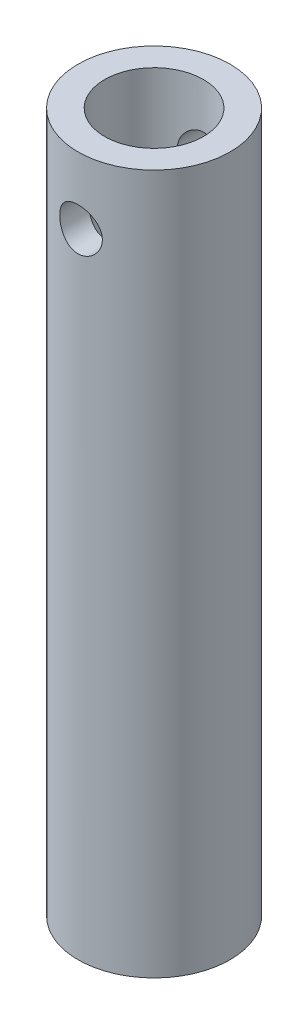
ISO-10303-21;
HEADER;
FILE_DESCRIPTION(('STEP AP214'),'2;1');
FILE_NAME('part.step','',(''),(''),'','','');
FILE_SCHEMA(('AUTOMOTIVE_DESIGN { 1 0 10303 214 1 1 1 1 }'));
ENDSEC;
DATA;
#1=APPLICATION_CONTEXT('core data for automotive mechanical design processes');
#2=APPLICATION_PROTOCOL_DEFINITION('international standard','automotive_design',2000,#1);
#3=PRODUCT_CONTEXT('',#1,'mechanical');
#4=PRODUCT('Part','Part','',(#3));
#5=PRODUCT_RELATED_PRODUCT_CATEGORY('part','',(#4));
#6=PRODUCT_DEFINITION_FORMATION('','',#4);
#7=PRODUCT_DEFINITION_CONTEXT('part definition',#1,'design');
#8=PRODUCT_DEFINITION('design','',#6,#7);
#9=PRODUCT_DEFINITION_SHAPE('','',#8);
#10=(LENGTH_UNIT() NAMED_UNIT(*) SI_UNIT(.MILLI.,.METRE.));
#11=(NAMED_UNIT(*) PLANE_ANGLE_UNIT() SI_UNIT($,.RADIAN.));
#12=(NAMED_UNIT(*) SI_UNIT($,.STERADIAN.) SOLID_ANGLE_UNIT());
#13=UNCERTAINTY_MEASURE_WITH_UNIT(LENGTH_MEASURE(1.E-05),#10,'distance_accuracy_value','');
#14=(GEOMETRIC_REPRESENTATION_CONTEXT(3) GLOBAL_UNCERTAINTY_ASSIGNED_CONTEXT((#13)) GLOBAL_UNIT_ASSIGNED_CONTEXT((#10,
#11,#12)) REPRESENTATION_CONTEXT('',''));
#15=CARTESIAN_POINT('',(0.,0.,0.));
#16=DIRECTION('',(0.,0.,1.));
#17=DIRECTION('',(1.,0.,0.));
#18=AXIS2_PLACEMENT_3D('',#15,#16,#17);
#19=CARTESIAN_POINT('',(0.,0.,0.));
#20=DIRECTION('',(0.,-1.,0.));
#21=DIRECTION('',(0.,0.,-1.));
#22=AXIS2_PLACEMENT_3D('',#19,#20,#21);
#23=CYLINDRICAL_SURFACE('',#22,5.);
#24=CARTESIAN_POINT('',(-1.4,41.6,4.8));
#25=CARTESIAN_POINT('',(-1.39999846094914,41.6769659298858,4.80000116728407));
#26=CARTESIAN_POINT('',(-1.39363150533867,41.7539476164528,4.80187142176869));
#27=CARTESIAN_POINT('',(-1.36838679401883,41.9056771416332,4.80912513994316));
#28=CARTESIAN_POINT('',(-1.34950358963581,41.9804239925426,4.81451013368184));
#29=CARTESIAN_POINT('',(-1.29990434687922,42.1254665067442,4.82813668155635));
#30=CARTESIAN_POINT('',(-1.26920611122644,42.1957686825419,4.83637393608176));
#31=CARTESIAN_POINT('',(-1.19690512813336,42.3302386159557,4.85477126739663));
#32=CARTESIAN_POINT('',(-1.15530122087737,42.3944057201172,4.86493154866758));
#33=CARTESIAN_POINT('',(-1.06114275468311,42.5165529838908,4.88634412299458));
#34=CARTESIAN_POINT('',(-1.00834099737541,42.5743389639482,4.89761732891019));
#35=CARTESIAN_POINT('',(-0.893816601905838,42.6803621013389,4.91980577835347));
#36=CARTESIAN_POINT('',(-0.832092958306449,42.7285981810079,4.93072098136626));
#37=CARTESIAN_POINT('',(-0.700116909454538,42.8149748989167,4.9511985717483));
#38=CARTESIAN_POINT('',(-0.629732260141498,42.8529205764065,4.96073342375542));
#39=CARTESIAN_POINT('',(-0.483269831180904,42.9163646054877,4.97713487630929));
#40=CARTESIAN_POINT('',(-0.407193117198153,42.9418652803328,4.98400197482787));
#41=CARTESIAN_POINT('',(-0.253534824248687,42.9790615168387,4.99414627569901));
#42=CARTESIAN_POINT('',(-0.176039082241839,42.9910878404104,4.99750934082078));
#43=CARTESIAN_POINT('',(-0.0200618306725404,43.0020366524892,5.0005676959715));
#44=CARTESIAN_POINT('',(0.0584194950033849,43.0009615501656,5.00026366032921));
#45=CARTESIAN_POINT('',(0.211830874345753,42.9859667444535,4.99608412754308));
#46=CARTESIAN_POINT('',(0.28679901525802,42.9724047068888,4.99230808388081));
#47=CARTESIAN_POINT('',(0.433349451843502,42.933401307128,4.98172751793994));
#48=CARTESIAN_POINT('',(0.50493154490278,42.9079592350436,4.97492281468571));
#49=CARTESIAN_POINT('',(0.64356653417568,42.8456564042964,4.95890589379392));
#50=CARTESIAN_POINT('',(0.71056313745783,42.8086770337964,4.94966883112298));
#51=CARTESIAN_POINT('',(0.837519083052786,42.7244413600416,4.92977657041354));
#52=CARTESIAN_POINT('',(0.897476930293568,42.6771828795045,4.91912107211315));
#53=CARTESIAN_POINT('',(1.01078870393436,42.5718483042977,4.8971168137207));
#54=CARTESIAN_POINT('',(1.06385145006009,42.513460943931,4.88575679332709));
#55=CARTESIAN_POINT('',(1.15950771223469,42.3885008756987,4.86394443478091));
#56=CARTESIAN_POINT('',(1.20210044712442,42.3219275576408,4.85349216439244));
#57=CARTESIAN_POINT('',(1.27586020154395,42.1818022200025,4.83463000670278));
#58=CARTESIAN_POINT('',(1.30694032351486,42.1082021961851,4.82623580811576));
#59=CARTESIAN_POINT('',(1.35618652914374,41.9565262981445,4.81263110576324));
#60=CARTESIAN_POINT('',(1.37435619769613,41.8784516729131,4.80741971827105));
#61=CARTESIAN_POINT('',(1.39674755802298,41.7227848973634,4.80096120977581));
#62=CARTESIAN_POINT('',(1.40140682196845,41.6452607817949,4.79958977360412));
#63=CARTESIAN_POINT('',(1.39785708173985,41.4905395473235,4.80062489240105));
#64=CARTESIAN_POINT('',(1.38964960911732,41.4133423905989,4.80303099772196));
#65=CARTESIAN_POINT('',(1.36098674315498,41.2632052586876,4.81122924489054));
#66=CARTESIAN_POINT('',(1.34080153845445,41.1902092150406,4.81694662610026));
#67=CARTESIAN_POINT('',(1.2890636214304,41.048640827144,4.83104846338543));
#68=CARTESIAN_POINT('',(1.25750931530452,40.9800691047175,4.83943329338373));
#69=CARTESIAN_POINT('',(1.18306339424192,40.8474848682545,4.85817493791623));
#70=CARTESIAN_POINT('',(1.13991875668025,40.7836205559952,4.868574106982));
#71=CARTESIAN_POINT('',(1.04382535551189,40.6638779023745,4.89007649908404));
#72=CARTESIAN_POINT('',(0.990874553387364,40.60800122578,4.90117986819416));
#73=CARTESIAN_POINT('',(0.874634922111244,40.5039661089508,4.92327316937945));
#74=CARTESIAN_POINT('',(0.811067688377642,40.4561148203352,4.93424788588004));
#75=CARTESIAN_POINT('',(0.676552150082872,40.3717580295338,4.95448242786587));
#76=CARTESIAN_POINT('',(0.605604235750171,40.3352519279162,4.96374234394348));
#77=CARTESIAN_POINT('',(0.458837080620815,40.2749671765905,4.97944452424279));
#78=CARTESIAN_POINT('',(0.383059761979972,40.2510922690681,4.98590802791053));
#79=CARTESIAN_POINT('',(0.22835840988794,40.2164788076392,4.99538286173743));
#80=CARTESIAN_POINT('',(0.149435156159181,40.2057370193275,4.99839504187191));
#81=CARTESIAN_POINT('',(-0.00646074749381435,40.19791440352,5.00058316769304));
#82=CARTESIAN_POINT('',(-0.083409429980672,40.2003851306364,4.99988504950269));
#83=CARTESIAN_POINT('',(-0.235751254024445,40.2178642590766,4.99502047571148));
#84=CARTESIAN_POINT('',(-0.311144464836564,40.2328721009631,4.99085417486961));
#85=CARTESIAN_POINT('',(-0.457637512916759,40.2747359069444,4.97955075921071));
#86=CARTESIAN_POINT('',(-0.528767741189635,40.301492697122,4.97243853906127));
#87=CARTESIAN_POINT('',(-0.665569134027809,40.3660066752,4.95598326056242));
#88=CARTESIAN_POINT('',(-0.731239474238709,40.4037655203693,4.94663986616359));
#89=CARTESIAN_POINT('',(-0.857310738423172,40.4904779988191,4.92637951709497));
#90=CARTESIAN_POINT('',(-0.917505254191581,40.5397229020334,4.91542497315988));
#91=CARTESIAN_POINT('',(-1.02892738400894,40.6474681189736,4.8933160260062));
#92=CARTESIAN_POINT('',(-1.08015255133947,40.7059709498786,4.88216156916595));
#93=CARTESIAN_POINT('',(-1.1734540054092,40.8323247481879,4.86059261767263));
#94=CARTESIAN_POINT('',(-1.21527034952428,40.9003724182135,4.85020350552202));
#95=CARTESIAN_POINT('',(-1.28681304035863,41.0428146608271,4.83171669264465));
#96=CARTESIAN_POINT('',(-1.31654651115799,41.1172054620991,4.82361764255334));
#97=CARTESIAN_POINT('',(-1.35964867256214,41.2593218997661,4.8116297141418));
#98=CARTESIAN_POINT('',(-1.37474260875013,41.3264921592486,4.80730606134675));
#99=CARTESIAN_POINT('',(-1.39491824305981,41.4624375713905,4.80149088551332));
#100=CARTESIAN_POINT('',(-1.40000137551085,41.5312124927079,4.79999895675188));
#101=CARTESIAN_POINT('',(-1.4,41.6,4.8));
#102=B_SPLINE_CURVE_WITH_KNOTS('',3,(#24,#25,#26,#27,#28,#29,#30,#31,#32,#33,#34,#35,#36,#37,
#38,#39,#40,#41,#42,#43,#44,#45,#46,#47,#48,#49,#50,#51,#52,#53,#54,#55,#56,#57,#58,#59,#60,#61,
#62,#63,#64,#65,#66,#67,#68,#69,#70,#71,#72,#73,#74,#75,#76,#77,#78,#79,#80,#81,#82,#83,#84,#85,
#86,#87,#88,#89,#90,#91,#92,#93,#94,#95,#96,#97,#98,#99,#100,#101),.UNSPECIFIED.,.T.,.F.,(4,2,2,
2,2,2,2,2,2,2,2,2,2,2,2,2,2,2,2,2,2,2,2,2,2,2,2,2,2,2,2,2,2,2,2,2,2,2,4),(0.,0.230644547119654,
0.461389566273118,0.691788254753479,0.92221145602993,1.15838055253431,1.39457628451212,
1.63497587607745,1.87533057226205,2.10964623883447,2.34391881867674,2.57168306807728,
2.79946092921251,3.02966229022292,3.25991245918694,3.49793361913972,3.73597253227433,
3.97577322729964,4.21550730991033,4.44738513963405,4.67923537060482,4.90604444612907,
5.13288532975909,5.365149674089,5.59746235613257,5.83726965112066,6.07706427354867,
6.3150041803502,6.55288547585395,6.78274520049664,7.01259466877346,7.2405401749279,
7.4685200348864,7.70307023270649,7.93768431334414,8.1781478109311,8.4184693244571,
8.62463505461541,8.83077124358129),.UNSPECIFIED.);
#103=CARTESIAN_POINT('',(-1.4,41.6,4.8));
#104=VERTEX_POINT('',#103);
#105=EDGE_CURVE('E73',#104,#104,#102,.T.);
#106=ORIENTED_EDGE('',*,*,#105,.T.);
#107=EDGE_LOOP('',(#106));
#108=FACE_BOUND('',#107,.T.);
#109=CARTESIAN_POINT('',(0.,46.,0.));
#110=DIRECTION('',(0.,-1.,0.));
#111=DIRECTION('',(0.,0.,-1.));
#112=AXIS2_PLACEMENT_3D('',#109,#110,#111);
#113=CIRCLE('',#112,5.);
#114=CARTESIAN_POINT('',(0.,46.,-5.));
#115=VERTEX_POINT('',#114);
#116=EDGE_CURVE('E10',#115,#115,#113,.T.);
#117=ORIENTED_EDGE('',*,*,#116,.T.);
#118=EDGE_LOOP('',(#117));
#119=FACE_BOUND('',#118,.T.);
#120=CARTESIAN_POINT('',(0.,0.,0.));
#121=DIRECTION('',(0.,-1.,0.));
#122=DIRECTION('',(0.,0.,-1.));
#123=AXIS2_PLACEMENT_3D('',#120,#121,#122);
#124=CIRCLE('',#123,5.);
#125=CARTESIAN_POINT('',(0.,0.,-5.));
#126=VERTEX_POINT('',#125);
#127=EDGE_CURVE('E84',#126,#126,#124,.T.);
#128=ORIENTED_EDGE('',*,*,#127,.F.);
#129=EDGE_LOOP('',(#128));
#130=FACE_BOUND('',#129,.T.);
#131=CARTESIAN_POINT('',(0.,43.,-5.));
#132=CARTESIAN_POINT('',(-0.0770327145729713,42.9999984893789,-4.99999900029696));
#133=CARTESIAN_POINT('',(-0.154081136740043,42.9936208655901,-4.99820245905414));
#134=CARTESIAN_POINT('',(-0.305948997089834,42.9683299449294,-4.9912105509116));
#135=CARTESIAN_POINT('',(-0.380767508720277,42.9494115110506,-4.98601379121481));
#136=CARTESIAN_POINT('',(-0.525962158797004,42.8997093467444,-4.97279343200931));
#137=CARTESIAN_POINT('',(-0.596344197953587,42.8689417809911,-4.96477368491707));
#138=CARTESIAN_POINT('',(-0.730949843609341,42.7964771545498,-4.946749433594));
#139=CARTESIAN_POINT('',(-0.795172875253764,42.7547790750089,-4.9367447443643));
#140=CARTESIAN_POINT('',(-0.917265077595306,42.6605220942066,-4.9155422190053));
#141=CARTESIAN_POINT('',(-0.974955969889462,42.6077372187264,-4.90432237800567));
#142=CARTESIAN_POINT('',(-1.08079329983553,42.4932874892586,-4.88209141574842));
#143=CARTESIAN_POINT('',(-1.1289383706349,42.4316213657572,-4.87108032458524));
#144=CARTESIAN_POINT('',(-1.21521302945673,42.2997036745525,-4.85028558598148));
#145=CARTESIAN_POINT('',(-1.25313270793239,42.2293100701614,-4.84052954568348));
#146=CARTESIAN_POINT('',(-1.31652628832609,42.0828287001048,-4.82367516293908));
#147=CARTESIAN_POINT('',(-1.3420027490408,42.0067421088471,-4.81657627415195));
#148=CARTESIAN_POINT('',(-1.37915835249243,41.8530201143085,-4.8060679730339));
#149=CARTESIAN_POINT('',(-1.39116289049922,41.775469447508,-4.80257172313195));
#150=CARTESIAN_POINT('',(-1.40204903325793,41.6193821629011,-4.79940552886254));
#151=CARTESIAN_POINT('',(-1.4009333652408,41.5408457533865,-4.7997347893054));
#152=CARTESIAN_POINT('',(-1.38586802479697,41.3875962925328,-4.80410498318563));
#153=CARTESIAN_POINT('',(-1.37231734248415,41.3128401957548,-4.80803051988166));
#154=CARTESIAN_POINT('',(-1.33340782537443,41.1667076432519,-4.81896544605214));
#155=CARTESIAN_POINT('',(-1.30804796098482,41.0953314828073,-4.82597510441519));
#156=CARTESIAN_POINT('',(-1.24592710596136,40.9569698467708,-4.84238625481907));
#157=CARTESIAN_POINT('',(-1.20903033319477,40.8900488246171,-4.85181597926293));
#158=CARTESIAN_POINT('',(-1.12497759066623,40.7632104044494,-4.87199022050669));
#159=CARTESIAN_POINT('',(-1.07781941706806,40.7032945151807,-4.88273501952731));
#160=CARTESIAN_POINT('',(-0.972565035243,40.5898937384194,-4.90480434363037));
#161=CARTESIAN_POINT('',(-0.914135248901377,40.5367193388453,-4.91613578960986));
#162=CARTESIAN_POINT('',(-0.789047798345443,40.4408568699801,-4.93775519353465));
#163=CARTESIAN_POINT('',(-0.722389740864611,40.3981693021943,-4.94804310156168));
#164=CARTESIAN_POINT('',(-0.582224966888401,40.3243358720784,-4.96649070133551));
#165=CARTESIAN_POINT('',(-0.508684489113187,40.2932510848785,-4.97463906607746));
#166=CARTESIAN_POINT('',(-0.357140122479902,40.2439782258357,-4.98780780944171));
#167=CARTESIAN_POINT('',(-0.279137317449736,40.225787036596,-4.99282894412588));
#168=CARTESIAN_POINT('',(-0.123528267665704,40.2033165846085,-4.99906109804467));
#169=CARTESIAN_POINT('',(-0.0459874326581305,40.1986157276385,-5.00038754197865));
#170=CARTESIAN_POINT('',(0.108776426212275,40.2020883711372,-4.99941533321488));
#171=CARTESIAN_POINT('',(0.185999485551479,40.2102603931094,-4.99711709682467));
#172=CARTESIAN_POINT('',(0.336397512488273,40.2389027349917,-4.98922874555777));
#173=CARTESIAN_POINT('',(0.409621765649552,40.2591335682751,-4.98370277490728));
#174=CARTESIAN_POINT('',(0.551626719729456,40.3110372833218,-4.96999007504664));
#175=CARTESIAN_POINT('',(0.620406914809998,40.3427114649115,-4.96180304358267));
#176=CARTESIAN_POINT('',(0.753176057754266,40.4173556766488,-4.94341133793915));
#177=CARTESIAN_POINT('',(0.817033767023282,40.4605493278687,-4.93316784050029));
#178=CARTESIAN_POINT('',(0.936741056940276,40.5567290068908,-4.91184479891555));
#179=CARTESIAN_POINT('',(0.99258888421398,40.6097171729332,-4.90076507252566));
#180=CARTESIAN_POINT('',(1.09649938873068,40.7259556372674,-4.87858629569558));
#181=CARTESIAN_POINT('',(1.14426345510986,40.7894753650262,-4.86749750838805));
#182=CARTESIAN_POINT('',(1.22846653416967,40.9238665041086,-4.84693260355014));
#183=CARTESIAN_POINT('',(1.26490597001672,40.9947376406008,-4.83745642576752));
#184=CARTESIAN_POINT('',(1.32515568180928,41.1415044657878,-4.82130025397621));
#185=CARTESIAN_POINT('',(1.34903525219373,41.2173699306397,-4.81460496149088));
#186=CARTESIAN_POINT('',(1.38362846644349,41.3722621449352,-4.80477906400824));
#187=CARTESIAN_POINT('',(1.39434590395942,41.4512879766994,-4.80164743189541));
#188=CARTESIAN_POINT('',(1.40207643676785,41.6071837578906,-4.79939533652457));
#189=CARTESIAN_POINT('',(1.3995719756054,41.6840280837597,-4.80013365834011));
#190=CARTESIAN_POINT('',(1.38206149373553,41.8361519316651,-4.8052041945668));
#191=CARTESIAN_POINT('',(1.36705585975352,41.9114315020335,-4.80953629780384));
#192=CARTESIAN_POINT('',(1.32526152105332,42.057611795769,-4.82121794437136));
#193=CARTESIAN_POINT('',(1.29858491712657,42.128547032041,-4.82853873737711));
#194=CARTESIAN_POINT('',(1.23429257584711,42.2649904019804,-4.84537110346427));
#195=CARTESIAN_POINT('',(1.19667496748523,42.3304976049419,-4.85488305119474));
#196=CARTESIAN_POINT('',(1.11014809012595,42.4565037278744,-4.87540826050106));
#197=CARTESIAN_POINT('',(1.06091437202679,42.5167736051544,-4.88645998809172));
#198=CARTESIAN_POINT('',(0.953157030759441,42.628352710852,-4.9086161413664));
#199=CARTESIAN_POINT('',(0.894631097907475,42.6796597047679,-4.91972057948473));
#200=CARTESIAN_POINT('',(0.768234423803878,42.773090119644,-4.94105425579585));
#201=CARTESIAN_POINT('',(0.700171058796768,42.8149598968524,-4.9512556469523));
#202=CARTESIAN_POINT('',(0.557686261861201,42.8865986111093,-4.96931868025536));
#203=CARTESIAN_POINT('',(0.483268522983519,42.9163745197469,-4.97718166968672));
#204=CARTESIAN_POINT('',(0.341052181714766,42.9595593271196,-4.98879098264941));
#205=CARTESIAN_POINT('',(0.273805516328351,42.9746871703952,-4.99296218750469));
#206=CARTESIAN_POINT('',(0.137709953322042,42.9949075686508,-4.99856697568072));
#207=CARTESIAN_POINT('',(0.0688612526056983,43.0000013503777,-5.00000089365673));
#208=CARTESIAN_POINT('',(0.,43.,-5.));
#209=B_SPLINE_CURVE_WITH_KNOTS('',3,(#131,#132,#133,#134,#135,#136,#137,#138,#139,#140,#141,
#142,#143,#144,#145,#146,#147,#148,#149,#150,#151,#152,#153,#154,#155,#156,#157,#158,#159,#160,
#161,#162,#163,#164,#165,#166,#167,#168,#169,#170,#171,#172,#173,#174,#175,#176,#177,#178,#179,
#180,#181,#182,#183,#184,#185,#186,#187,#188,#189,#190,#191,#192,#193,#194,#195,#196,#197,#198,
#199,#200,#201,#202,#203,#204,#205,#206,#207,#208),.UNSPECIFIED.,.T.,.F.,(4,2,2,2,2,2,2,2,2,2,2,
2,2,2,2,2,2,2,2,2,2,2,2,2,2,2,2,2,2,2,2,2,2,2,2,2,2,2,4),(0.,0.230845454724487,0.46178552758447,
0.692411659940941,0.923059297021747,1.15896631327548,1.39490708436163,1.63537521509923,
1.8757938756438,2.11027142552802,2.34470023661011,2.5718605950441,2.79904076233936,
3.02900228295248,3.25901324112637,3.49733284938025,3.7356638524261,3.9752322675011,
4.21474274026858,4.4466820107644,4.67859464414303,4.9060481785949,5.13352755715304,
5.36579259943571,5.59810840751108,5.83770027387453,6.07728318635397,6.31553004318533,
6.55370821528107,6.7832571355847,7.0127989550261,7.24018281446682,7.4676055814576,
7.70234779932216,7.93714845659686,8.17765852294213,8.41802974824775,8.62441285537236,
8.83077072889118),.UNSPECIFIED.);
#210=CARTESIAN_POINT('',(0.,43.,-5.));
#211=VERTEX_POINT('',#210);
#212=EDGE_CURVE('E78',#211,#211,#209,.T.);
#213=ORIENTED_EDGE('',*,*,#212,.T.);
#214=EDGE_LOOP('',(#213));
#215=FACE_BOUND('',#214,.T.);
#216=ADVANCED_FACE('F31',(#108,#119,#130,#215),#23,.T.);
#217=CARTESIAN_POINT('',(0.,0.,0.));
#218=DIRECTION('',(0.,-1.,0.));
#219=DIRECTION('',(0.,0.,-1.));
#220=AXIS2_PLACEMENT_3D('',#217,#218,#219);
#221=CYLINDRICAL_SURFACE('',#220,3.25);
#222=CARTESIAN_POINT('',(-1.4,41.6,2.93300187521249));
#223=CARTESIAN_POINT('',(-1.39999093014388,41.5255905970456,2.93301088558229));
#224=CARTESIAN_POINT('',(-1.39403018986805,41.4510708180436,2.93587503097016));
#225=CARTESIAN_POINT('',(-1.3704252902362,41.3041977692494,2.94696321535698));
#226=CARTESIAN_POINT('',(-1.35275043272235,41.2318507154563,2.95520133656749));
#227=CARTESIAN_POINT('',(-1.3065487791051,41.0917202716736,2.97591388371925));
#228=CARTESIAN_POINT('',(-1.27806829176898,41.0239188399893,2.98837020792608));
#229=CARTESIAN_POINT('',(-1.21120040858192,40.8940743988769,3.01608991332933));
#230=CARTESIAN_POINT('',(-1.17281488275051,40.8320303054963,3.03135276451197));
#231=CARTESIAN_POINT('',(-1.08449405632017,40.7112936630653,3.06410156382041));
#232=CARTESIAN_POINT('',(-1.03400092879853,40.6530302975894,3.08166611976692));
#233=CARTESIAN_POINT('',(-0.924067826834253,40.5454785707361,3.11639541161537));
#234=CARTESIAN_POINT('',(-0.864624279049276,40.4961938113996,3.1335599846543));
#235=CARTESIAN_POINT('',(-0.735055194539326,40.4057552106996,3.16652210213821));
#236=CARTESIAN_POINT('',(-0.664559307049742,40.3650914117391,3.18221770868869));
#237=CARTESIAN_POINT('',(-0.516928211286968,40.2963879064639,3.20950250241949));
#238=CARTESIAN_POINT('',(-0.439796163542614,40.2683422298719,3.22109363108363));
#239=CARTESIAN_POINT('',(-0.285595215575721,40.2272488049191,3.2383046938537));
#240=CARTESIAN_POINT('',(-0.208757576112905,40.2134590187252,3.24421876493758));
#241=CARTESIAN_POINT('',(-0.0536469318825666,40.1988638336,3.25048245087373));
#242=CARTESIAN_POINT('',(0.0246254331475464,40.1980527820414,3.25083448815731));
#243=CARTESIAN_POINT('',(0.174960221219282,40.2090651195684,3.2461024585992));
#244=CARTESIAN_POINT('',(0.24709572392598,40.2200711209289,3.24137006865471));
#245=CARTESIAN_POINT('',(0.388379116409237,40.2529943863577,3.22749163400091));
#246=CARTESIAN_POINT('',(0.45752678491065,40.2749124570597,3.21834526300618));
#247=CARTESIAN_POINT('',(0.592150833757654,40.3292874367396,3.19633930528483));
#248=CARTESIAN_POINT('',(0.657554839870065,40.3619004876966,3.18342503749674));
#249=CARTESIAN_POINT('',(0.782133965204853,40.4365799625469,3.15513127677334));
#250=CARTESIAN_POINT('',(0.841306829735497,40.4786497911614,3.13975089653737));
#251=CARTESIAN_POINT('',(0.956437940690583,40.5746917071716,3.10669868686324));
#252=CARTESIAN_POINT('',(1.01182705582631,40.6293175844333,3.08894150959544));
#253=CARTESIAN_POINT('',(1.1129149231789,40.7470948730163,3.05397893030838));
#254=CARTESIAN_POINT('',(1.1586094070454,40.8102500196587,3.03677377415075));
#255=CARTESIAN_POINT('',(1.24061711426155,40.9462403024718,3.0042290452743));
#256=CARTESIAN_POINT('',(1.27651866663988,41.0193479247766,2.98898254712737));
#257=CARTESIAN_POINT('',(1.33526472779319,41.1714011062078,2.96320927599794));
#258=CARTESIAN_POINT('',(1.35811931722897,41.2503421047973,2.95267886052069));
#259=CARTESIAN_POINT('',(1.38862096792775,41.4061057504887,2.93845165995406));
#260=CARTESIAN_POINT('',(1.3971956461687,41.482708002584,2.93433924462269));
#261=CARTESIAN_POINT('',(1.40163420516463,41.6363508611614,2.93222290543734));
#262=CARTESIAN_POINT('',(1.39750301329099,41.7133912861526,2.9342166136106));
#263=CARTESIAN_POINT('',(1.37749503020388,41.859990516208,2.94365612836274));
#264=CARTESIAN_POINT('',(1.36246677192184,41.9296938830961,2.95070768294784));
#265=CARTESIAN_POINT('',(1.32223652637767,42.0655219375664,2.96895178392543));
#266=CARTESIAN_POINT('',(1.29703204964224,42.1316457449658,2.98014534354706));
#267=CARTESIAN_POINT('',(1.23595100406396,42.2616716653178,3.00600520763991));
#268=CARTESIAN_POINT('',(1.19965643978086,42.3253506430283,3.02080182348023));
#269=CARTESIAN_POINT('',(1.11783183256591,42.446033495775,3.05202685068084));
#270=CARTESIAN_POINT('',(1.07229760710689,42.5030343293106,3.06845599931661));
#271=CARTESIAN_POINT('',(0.968561641281718,42.6139774627374,3.1028415857099));
#272=CARTESIAN_POINT('',(0.909597088896468,42.6672072584592,3.12080499530673));
#273=CARTESIAN_POINT('',(0.783170573892042,42.7631598951,3.1549051349678));
#274=CARTESIAN_POINT('',(0.715707716050678,42.8058816276844,3.17104167224647));
#275=CARTESIAN_POINT('',(0.57348548498212,42.8796728433301,3.19982804591806));
#276=CARTESIAN_POINT('',(0.498688800394717,42.9106783845501,3.21245865190694));
#277=CARTESIAN_POINT('',(0.344252899379343,42.9594244793062,3.23265184464062));
#278=CARTESIAN_POINT('',(0.264616821082985,42.9771735318939,3.24021767820882));
#279=CARTESIAN_POINT('',(0.109107654383199,42.99777973654,3.24903225646612));
#280=CARTESIAN_POINT('',(0.0333906948525169,43.0016394020166,3.25070606338754));
#281=CARTESIAN_POINT('',(-0.117595557598838,42.9970941584147,3.24874849393872));
#282=CARTESIAN_POINT('',(-0.192864935961764,42.9886916708972,3.2451181650424));
#283=CARTESIAN_POINT('',(-0.337715720470401,42.9605796428864,3.23319119551847));
#284=CARTESIAN_POINT('',(-0.407404267081021,42.9413338680271,3.22508620469521));
#285=CARTESIAN_POINT('',(-0.542524026869703,42.8926054322312,3.20512656303101));
#286=CARTESIAN_POINT('',(-0.60795445876168,42.8631208989228,3.19327122639595));
#287=CARTESIAN_POINT('',(-0.73600135790037,42.7932572256845,3.16627211597094));
#288=CARTESIAN_POINT('',(-0.798352754840212,42.7524419470218,3.15100286516438));
#289=CARTESIAN_POINT('',(-0.915592652000102,42.6616924540471,3.11895655638203));
#290=CARTESIAN_POINT('',(-0.970478152987609,42.6117545937355,3.10217889691075));
#291=CARTESIAN_POINT('',(-1.07543268717154,42.4998620638735,3.06744542946636));
#292=CARTESIAN_POINT('',(-1.12485145272542,42.4372940256545,3.04949363990536));
#293=CARTESIAN_POINT('',(-1.21260620470089,42.3042285002219,3.01567673982518));
#294=CARTESIAN_POINT('',(-1.25093568508671,42.2337263916751,2.99981285723473));
#295=CARTESIAN_POINT('',(-1.31516965699396,42.0865875719933,2.97221388096729));
#296=CARTESIAN_POINT('',(-1.34108757795602,42.0099575965621,2.96047432840259));
#297=CARTESIAN_POINT('',(-1.37932345934367,41.8528878129908,2.94286063205464));
#298=CARTESIAN_POINT('',(-1.39168704006723,41.7724617409444,2.93696681949138));
#299=CARTESIAN_POINT('',(-1.39900299882393,41.661118247277,2.93347632828598));
#300=CARTESIAN_POINT('',(-1.40000372602548,41.6305684376268,2.93299817362484));
#301=CARTESIAN_POINT('',(-1.4,41.6,2.93300187521249));
#302=B_SPLINE_CURVE_WITH_KNOTS('',3,(#222,#223,#224,#225,#226,#227,#228,#229,#230,#231,#232,
#233,#234,#235,#236,#237,#238,#239,#240,#241,#242,#243,#244,#245,#246,#247,#248,#249,#250,#251,
#252,#253,#254,#255,#256,#257,#258,#259,#260,#261,#262,#263,#264,#265,#266,#267,#268,#269,#270,
#271,#272,#273,#274,#275,#276,#277,#278,#279,#280,#281,#282,#283,#284,#285,#286,#287,#288,#289,
#290,#291,#292,#293,#294,#295,#296,#297,#298,#299,#300,#301),.UNSPECIFIED.,.T.,.F.,(4,2,2,2,2,2,
2,2,2,2,2,2,2,2,2,2,2,2,2,2,2,2,2,2,2,2,2,2,2,2,2,2,2,2,2,2,2,2,2,4),(0.,0.223135920094107,
0.446858917370905,0.669633760322705,0.892366575280347,1.12856073674564,1.36484944701353,
1.61222556459683,1.85948451251169,2.09310289947503,2.32661953586922,2.54496549760324,
2.76332760213894,2.98503127873555,3.20681490346133,3.44514385028805,3.68357751177696,
3.93087072226507,4.17797260357014,4.40828820588281,4.63851450243489,4.85251105668223,
5.06655999402435,5.28995674794358,5.51345485360825,5.75665387173143,5.99987853020229,
6.24441206232659,6.48878868326307,6.71512711726157,6.94142085942494,7.15869989026888,
7.3760186760864,7.6032645143291,7.83060137485128,8.0746431196419,8.31882775366335,
8.56274757694694,8.80584388643553,8.89751128578112),.UNSPECIFIED.);
#303=CARTESIAN_POINT('',(-1.4,41.6,2.93300187521249));
#304=VERTEX_POINT('',#303);
#305=EDGE_CURVE('E52',#304,#304,#302,.T.);
#306=ORIENTED_EDGE('',*,*,#305,.T.);
#307=EDGE_LOOP('',(#306));
#308=FACE_BOUND('',#307,.T.);
#309=CARTESIAN_POINT('',(0.,12.,0.));
#310=DIRECTION('',(0.,-1.,0.));
#311=DIRECTION('',(0.,0.,-1.));
#312=AXIS2_PLACEMENT_3D('',#309,#310,#311);
#313=CIRCLE('',#312,3.25);
#314=CARTESIAN_POINT('',(0.,12.,-3.25));
#315=VERTEX_POINT('',#314);
#316=EDGE_CURVE('E49',#315,#315,#313,.T.);
#317=ORIENTED_EDGE('',*,*,#316,.T.);
#318=EDGE_LOOP('',(#317));
#319=FACE_BOUND('',#318,.T.);
#320=CARTESIAN_POINT('',(0.,46.,0.));
#321=DIRECTION('',(0.,-1.,0.));
#322=DIRECTION('',(0.,0.,-1.));
#323=AXIS2_PLACEMENT_3D('',#320,#321,#322);
#324=CIRCLE('',#323,3.25);
#325=CARTESIAN_POINT('',(0.,46.,-3.25));
#326=VERTEX_POINT('',#325);
#327=EDGE_CURVE('E44',#326,#326,#324,.T.);
#328=ORIENTED_EDGE('',*,*,#327,.F.);
#329=EDGE_LOOP('',(#328));
#330=FACE_BOUND('',#329,.T.);
#331=CARTESIAN_POINT('',(0.,43.,-3.25));
#332=CARTESIAN_POINT('',(0.0747743147945643,42.9999913237963,-3.24999339428539));
#333=CARTESIAN_POINT('',(0.149654577301456,42.993974299065,-3.24738996837437));
#334=CARTESIAN_POINT('',(0.297282867223013,42.9701253800155,-3.23722621698088));
#335=CARTESIAN_POINT('',(0.370025066681506,42.9522638481127,-3.22965345762084));
#336=CARTESIAN_POINT('',(0.510995871705431,42.9055175931012,-3.21036223920508));
#337=CARTESIAN_POINT('',(0.579239228130689,42.8766712370335,-3.19865821981252));
#338=CARTESIAN_POINT('',(0.709848075632318,42.8089381290452,-3.17223292035702));
#339=CARTESIAN_POINT('',(0.772215118290818,42.7700540376865,-3.15751244003804));
#340=CARTESIAN_POINT('',(0.892703755275299,42.6811806516239,-3.12564392498068));
#341=CARTESIAN_POINT('',(0.950474056512367,42.6307451570414,-3.10841290803657));
#342=CARTESIAN_POINT('',(1.05704218417876,42.5211458614407,-3.07380987589992));
#343=CARTESIAN_POINT('',(1.10583497992168,42.4619771999181,-3.05643778731385));
#344=CARTESIAN_POINT('',(1.19564555354856,42.332765341118,-3.02247609346468));
#345=CARTESIAN_POINT('',(1.23610869824349,42.2623100573412,-3.00597787367286));
#346=CARTESIAN_POINT('',(1.30445280731839,42.1147826518719,-2.97696013585359));
#347=CARTESIAN_POINT('',(1.33234069019882,42.0377141963814,-2.96443843120093));
#348=CARTESIAN_POINT('',(1.37326686956236,41.8831915498328,-2.94569595516167));
#349=CARTESIAN_POINT('',(1.38698361216309,41.8059531535741,-2.93918906113811));
#350=CARTESIAN_POINT('',(1.40129160183223,41.6500182141194,-2.93239686795149));
#351=CARTESIAN_POINT('',(1.40189082517852,41.571322586153,-2.93210778796775));
#352=CARTESIAN_POINT('',(1.39045519587113,41.4216881225234,-2.93754345515719));
#353=CARTESIAN_POINT('',(1.37946495694422,41.3506476553248,-2.94277099214311));
#354=CARTESIAN_POINT('',(1.34692369366352,41.2115397337023,-2.95780566938122));
#355=CARTESIAN_POINT('',(1.32537047772325,41.1434728994354,-2.96761375997811));
#356=CARTESIAN_POINT('',(1.27188980323503,41.0104670738309,-2.99092961754472));
#357=CARTESIAN_POINT('',(1.23974528528026,40.9456293578002,-3.00451377293995));
#358=CARTESIAN_POINT('',(1.16614913925896,40.8220047595963,-3.03383633415045));
#359=CARTESIAN_POINT('',(1.12469370720232,40.7632203648751,-3.04957561941895));
#360=CARTESIAN_POINT('',(1.02923241728228,40.6477451501721,-3.08317423229472));
#361=CARTESIAN_POINT('',(0.974428159075206,40.5917306281335,-3.1010962054922));
#362=CARTESIAN_POINT('',(0.856039165512505,40.4894514527876,-3.13584129403117));
#363=CARTESIAN_POINT('',(0.792452090963521,40.4431894052502,-3.15266411486301));
#364=CARTESIAN_POINT('',(0.656126410366088,40.3606419164053,-3.1838667347346));
#365=CARTESIAN_POINT('',(0.583191622580241,40.3246497468621,-3.1981709442796));
#366=CARTESIAN_POINT('',(0.431528231049239,40.2656867441818,-3.22213618529482));
#367=CARTESIAN_POINT('',(0.352803086545775,40.242708206769,-3.23179996345706));
#368=CARTESIAN_POINT('',(0.197429676511008,40.2118822611373,-3.24487143262876));
#369=CARTESIAN_POINT('',(0.120992747178559,40.2031283735959,-3.24865319009081));
#370=CARTESIAN_POINT('',(-0.0323460857068967,40.1982752331596,-3.25074230284361));
#371=CARTESIAN_POINT('',(-0.109247836318495,40.202172022293,-3.24905137035571));
#372=CARTESIAN_POINT('',(-0.256967709195121,40.2218772287353,-3.24062518831453));
#373=CARTESIAN_POINT('',(-0.327890483860699,40.2370331879918,-3.23416635864274));
#374=CARTESIAN_POINT('',(-0.466099018843011,40.277900580018,-3.21715758849296));
#375=CARTESIAN_POINT('',(-0.533384326799732,40.3036133222411,-3.20660714050354));
#376=CARTESIAN_POINT('',(-0.664787723695427,40.3656972753737,-3.18200680772817));
#377=CARTESIAN_POINT('',(-0.728741198775436,40.4023763673258,-3.16785789569959));
#378=CARTESIAN_POINT('',(-0.849816114699777,40.4850154055274,-3.13754905496863));
#379=CARTESIAN_POINT('',(-0.906934612358058,40.5309793271484,-3.12138826600671));
#380=CARTESIAN_POINT('',(-1.01729426965012,40.6349671001086,-3.08726386256681));
#381=CARTESIAN_POINT('',(-1.06990954471269,40.6936425390463,-3.06925664536286));
#382=CARTESIAN_POINT('',(-1.16473943587464,40.819246340024,-3.03454085632865));
#383=CARTESIAN_POINT('',(-1.20695105583717,40.886177071189,-3.01783265954793));
#384=CARTESIAN_POINT('',(-1.28041652845928,41.0281306975925,-2.98741531959426));
#385=CARTESIAN_POINT('',(-1.31145106049832,41.1032813549177,-2.97376800006542));
#386=CARTESIAN_POINT('',(-1.3601441958514,41.2585189018729,-2.95181878622207));
#387=CARTESIAN_POINT('',(-1.3778148584137,41.3386012704876,-2.94351207368382));
#388=CARTESIAN_POINT('',(-1.39804234125831,41.4944377256954,-2.93395488869139));
#389=CARTESIAN_POINT('',(-1.40170796318589,41.5700166172753,-2.93218711984912));
#390=CARTESIAN_POINT('',(-1.39682280520575,41.7206781425298,-2.9345177080823));
#391=CARTESIAN_POINT('',(-1.38827423652808,41.7957608635579,-2.93861500335975));
#392=CARTESIAN_POINT('',(-1.36015532774973,41.9391691369352,-2.95172765727725));
#393=CARTESIAN_POINT('',(-1.34119494498604,42.0076417298145,-2.96047004579556));
#394=CARTESIAN_POINT('',(-1.29341027958648,42.1404380730061,-2.98165544174928));
#395=CARTESIAN_POINT('',(-1.2645831862616,42.2047606349041,-2.99409950353266));
#396=CARTESIAN_POINT('',(-1.19582221545746,42.3318112575061,-3.0222457104165));
#397=CARTESIAN_POINT('',(-1.1553083941347,42.3941904828797,-3.0381025072588));
#398=CARTESIAN_POINT('',(-1.06510626316253,42.5116110157426,-3.07088748685689));
#399=CARTESIAN_POINT('',(-1.01541443294704,42.5666494934165,-3.08781607909638));
#400=CARTESIAN_POINT('',(-0.903553414320237,42.6723691682708,-3.12246426086735));
#401=CARTESIAN_POINT('',(-0.840703782110391,42.7223487134352,-3.14013866722033));
#402=CARTESIAN_POINT('',(-0.706870730196815,42.811106476957,-3.17294402866348));
#403=CARTESIAN_POINT('',(-0.635883642845537,42.8498796165118,-3.18807382923011));
#404=CARTESIAN_POINT('',(-0.488675553252782,42.914368392909,-3.21390771600178));
#405=CARTESIAN_POINT('',(-0.412542950792215,42.9402612392894,-3.22467146663655));
#406=CARTESIAN_POINT('',(-0.25656998826248,42.9786150131395,-3.24079743683219));
#407=CARTESIAN_POINT('',(-0.176741897139314,42.9911174680653,-3.24617635290638));
#408=CARTESIAN_POINT('',(-0.0643702219954288,42.998893625038,-3.24952428176914));
#409=CARTESIAN_POINT('',(-0.0321949314550581,43.0000037356382,-3.25000284416554));
#410=CARTESIAN_POINT('',(0.,43.,-3.25));
#411=B_SPLINE_CURVE_WITH_KNOTS('',3,(#331,#332,#333,#334,#335,#336,#337,#338,#339,#340,#341,
#342,#343,#344,#345,#346,#347,#348,#349,#350,#351,#352,#353,#354,#355,#356,#357,#358,#359,#360,
#361,#362,#363,#364,#365,#366,#367,#368,#369,#370,#371,#372,#373,#374,#375,#376,#377,#378,#379,
#380,#381,#382,#383,#384,#385,#386,#387,#388,#389,#390,#391,#392,#393,#394,#395,#396,#397,#398,
#399,#400,#401,#402,#403,#404,#405,#406,#407,#408,#409,#410),.UNSPECIFIED.,.T.,.F.,(4,2,2,2,2,2,
2,2,2,2,2,2,2,2,2,2,2,2,2,2,2,2,2,2,2,2,2,2,2,2,2,2,2,2,2,2,2,2,2,4),(0.,0.224226756343229,
0.449016705614223,0.673028620135577,0.896981219809071,1.13176691375259,1.36668377550012,
1.61415083488292,1.86148157931772,2.09632904598335,2.33103370662884,2.54625575579683,
2.76152247774454,2.98150812101294,3.20158380381253,3.44166897566153,3.68181821494036,
3.9282618538713,4.17455944135414,4.40443996114146,4.6342485659682,4.85168725376917,
5.0691529206102,5.29341232329956,5.51776794868493,5.75919764276547,6.00069678487905,
6.24670520627611,6.49249136958205,6.71835846806671,6.94418468125222,7.15800820959339,
7.3718926997234,7.59909870729176,7.82639204984806,8.07188307236836,8.3174851788944,
8.55960772091477,8.80097717742065,8.8975205569313),.UNSPECIFIED.);
#412=CARTESIAN_POINT('',(0.,43.,-3.25));
#413=VERTEX_POINT('',#412);
#414=EDGE_CURVE('E35',#413,#413,#411,.T.);
#415=ORIENTED_EDGE('',*,*,#414,.T.);
#416=EDGE_LOOP('',(#415));
#417=FACE_BOUND('',#416,.T.);
#418=ADVANCED_FACE('F57',(#308,#319,#330,#417),#221,.F.);
#419=CARTESIAN_POINT('',(5.,46.,0.));
#420=DIRECTION('',(0.,1.,0.));
#421=DIRECTION('',(0.,0.,1.));
#422=AXIS2_PLACEMENT_3D('',#419,#420,#421);
#423=PLANE('',#422);
#424=ORIENTED_EDGE('',*,*,#327,.T.);
#425=EDGE_LOOP('',(#424));
#426=FACE_BOUND('',#425,.T.);
#427=ORIENTED_EDGE('',*,*,#116,.F.);
#428=EDGE_LOOP('',(#427));
#429=FACE_BOUND('',#428,.T.);
#430=ADVANCED_FACE('F100',(#426,#429),#423,.T.);
#431=CARTESIAN_POINT('',(2.15,12.,0.));
#432=DIRECTION('',(0.,1.,0.));
#433=DIRECTION('',(0.,0.,1.));
#434=AXIS2_PLACEMENT_3D('',#431,#432,#433);
#435=PLANE('',#434);
#436=CARTESIAN_POINT('',(0.,12.,0.));
#437=DIRECTION('',(0.,-1.,0.));
#438=DIRECTION('',(0.,0.,-1.));
#439=AXIS2_PLACEMENT_3D('',#436,#437,#438);
#440=CIRCLE('',#439,2.15);
#441=CARTESIAN_POINT('',(0.,12.,-2.15));
#442=VERTEX_POINT('',#441);
#443=EDGE_CURVE('E90',#442,#442,#440,.T.);
#444=ORIENTED_EDGE('',*,*,#443,.T.);
#445=EDGE_LOOP('',(#444));
#446=FACE_BOUND('',#445,.T.);
#447=ORIENTED_EDGE('',*,*,#316,.F.);
#448=EDGE_LOOP('',(#447));
#449=FACE_BOUND('',#448,.T.);
#450=ADVANCED_FACE('F97',(#446,#449),#435,.T.);
#451=CARTESIAN_POINT('',(0.,0.,0.));
#452=DIRECTION('',(0.,-1.,0.));
#453=DIRECTION('',(0.,0.,-1.));
#454=AXIS2_PLACEMENT_3D('',#451,#452,#453);
#455=CYLINDRICAL_SURFACE('',#454,2.15);
#456=CARTESIAN_POINT('',(0.,0.,0.));
#457=DIRECTION('',(0.,-1.,0.));
#458=DIRECTION('',(0.,0.,-1.));
#459=AXIS2_PLACEMENT_3D('',#456,#457,#458);
#460=CIRCLE('',#459,2.15);
#461=CARTESIAN_POINT('',(0.,0.,-2.15));
#462=VERTEX_POINT('',#461);
#463=EDGE_CURVE('E87',#462,#462,#460,.T.);
#464=ORIENTED_EDGE('',*,*,#463,.T.);
#465=EDGE_LOOP('',(#464));
#466=FACE_BOUND('',#465,.T.);
#467=ORIENTED_EDGE('',*,*,#443,.F.);
#468=EDGE_LOOP('',(#467));
#469=FACE_BOUND('',#468,.T.);
#470=ADVANCED_FACE('F99',(#466,#469),#455,.F.);
#471=CARTESIAN_POINT('',(2.15,0.,0.));
#472=DIRECTION('',(0.,-1.,0.));
#473=DIRECTION('',(0.,0.,-1.));
#474=AXIS2_PLACEMENT_3D('',#471,#472,#473);
#475=PLANE('',#474);
#476=ORIENTED_EDGE('',*,*,#127,.T.);
#477=EDGE_LOOP('',(#476));
#478=FACE_BOUND('',#477,.T.);
#479=ORIENTED_EDGE('',*,*,#463,.F.);
#480=EDGE_LOOP('',(#479));
#481=FACE_BOUND('',#480,.T.);
#482=ADVANCED_FACE('F65',(#478,#481),#475,.T.);
#483=CARTESIAN_POINT('',(0.,41.6,10.));
#484=DIRECTION('',(0.,0.,-1.));
#485=DIRECTION('',(-1.,0.,0.));
#486=AXIS2_PLACEMENT_3D('',#483,#484,#485);
#487=CYLINDRICAL_SURFACE('',#486,1.4);
#488=ORIENTED_EDGE('',*,*,#105,.F.);
#489=EDGE_LOOP('',(#488));
#490=FACE_BOUND('',#489,.T.);
#491=ORIENTED_EDGE('',*,*,#305,.F.);
#492=EDGE_LOOP('',(#491));
#493=FACE_BOUND('',#492,.T.);
#494=ADVANCED_FACE('F60',(#490,#493),#487,.F.);
#495=ORIENTED_EDGE('',*,*,#212,.F.);
#496=EDGE_LOOP('',(#495));
#497=FACE_BOUND('',#496,.T.);
#498=ORIENTED_EDGE('',*,*,#414,.F.);
#499=EDGE_LOOP('',(#498));
#500=FACE_BOUND('',#499,.T.);
#501=ADVANCED_FACE('F64',(#497,#500),#487,.F.);
#502=CLOSED_SHELL('',(#216,#418,#430,#450,#470,#482,#494,#501));
#503=MANIFOLD_SOLID_BREP('B2',#502);
#504=ADVANCED_BREP_SHAPE_REPRESENTATION('',(#18,#503),#14);
#505=SHAPE_DEFINITION_REPRESENTATION(#9,#504);
ENDSEC;
END-ISO-10303-21;
